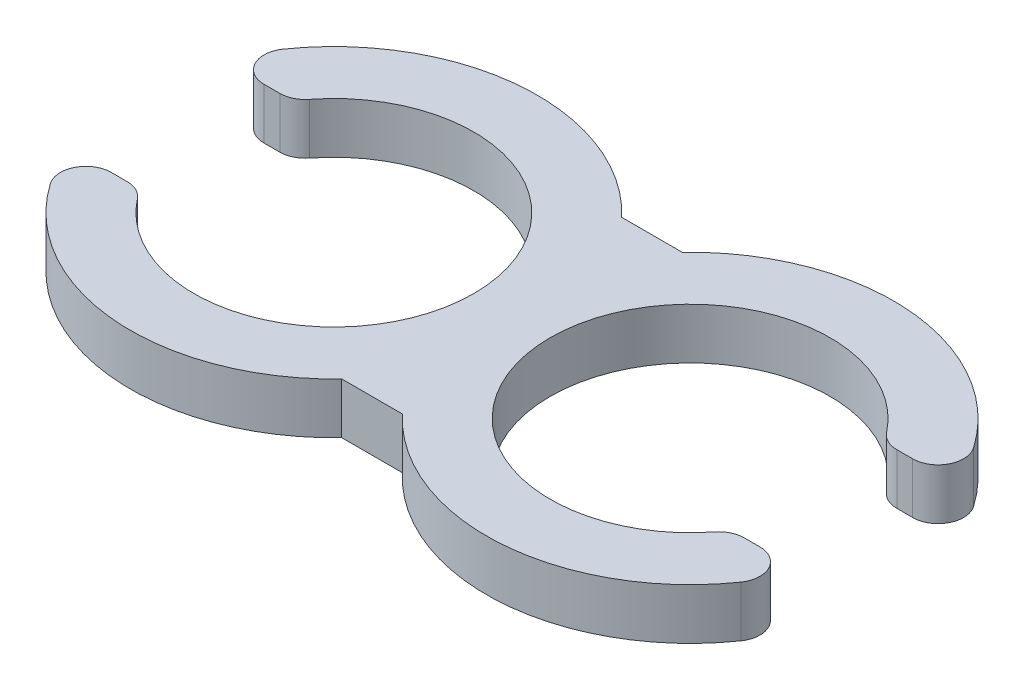
ISO-10303-21;
HEADER;
FILE_DESCRIPTION(('STEP AP214'),'2;1');
FILE_NAME('part.step','',(''),(''),'','','');
FILE_SCHEMA(('AUTOMOTIVE_DESIGN { 1 0 10303 214 1 1 1 1 }'));
ENDSEC;
DATA;
#1=APPLICATION_CONTEXT('core data for automotive mechanical design processes');
#2=APPLICATION_PROTOCOL_DEFINITION('international standard','automotive_design',2000,#1);
#3=PRODUCT_CONTEXT('',#1,'mechanical');
#4=PRODUCT('Part','Part','',(#3));
#5=PRODUCT_RELATED_PRODUCT_CATEGORY('part','',(#4));
#6=PRODUCT_DEFINITION_FORMATION('','',#4);
#7=PRODUCT_DEFINITION_CONTEXT('part definition',#1,'design');
#8=PRODUCT_DEFINITION('design','',#6,#7);
#9=PRODUCT_DEFINITION_SHAPE('','',#8);
#10=(LENGTH_UNIT() NAMED_UNIT(*) SI_UNIT(.MILLI.,.METRE.));
#11=(NAMED_UNIT(*) PLANE_ANGLE_UNIT() SI_UNIT($,.RADIAN.));
#12=(NAMED_UNIT(*) SI_UNIT($,.STERADIAN.) SOLID_ANGLE_UNIT());
#13=UNCERTAINTY_MEASURE_WITH_UNIT(LENGTH_MEASURE(1.E-05),#10,'distance_accuracy_value','');
#14=(GEOMETRIC_REPRESENTATION_CONTEXT(3) GLOBAL_UNCERTAINTY_ASSIGNED_CONTEXT((#13)) GLOBAL_UNIT_ASSIGNED_CONTEXT((#10,
#11,#12)) REPRESENTATION_CONTEXT('',''));
#15=CARTESIAN_POINT('',(0.,0.,0.));
#16=DIRECTION('',(0.,0.,1.));
#17=DIRECTION('',(1.,0.,0.));
#18=AXIS2_PLACEMENT_3D('',#15,#16,#17);
#19=CARTESIAN_POINT('',(0.,2.,3.));
#20=DIRECTION('',(0.,0.,1.));
#21=DIRECTION('',(1.,0.,0.));
#22=AXIS2_PLACEMENT_3D('',#19,#20,#21);
#23=PLANE('',#22);
#24=DIRECTION('',(-1.,0.,0.));
#25=VECTOR('',#24,1.);
#26=CARTESIAN_POINT('',(0.,2.,3.));
#27=LINE('',#26,#25);
#28=CARTESIAN_POINT('',(-12.1234753829798,2.,3.));
#29=VERTEX_POINT('',#28);
#30=CARTESIAN_POINT('',(-12.744562646538,2.,3.));
#31=VERTEX_POINT('',#30);
#32=EDGE_CURVE('E189',#29,#31,#27,.T.);
#33=ORIENTED_EDGE('',*,*,#32,.F.);
#34=DIRECTION('',(0.,1.,0.));
#35=VECTOR('',#34,1.);
#36=CARTESIAN_POINT('',(-12.1234753829798,0.,3.));
#37=LINE('',#36,#35);
#38=CARTESIAN_POINT('',(-12.1234753829798,0.,3.));
#39=VERTEX_POINT('',#38);
#40=EDGE_CURVE('E325',#29,#39,#37,.F.);
#41=ORIENTED_EDGE('',*,*,#40,.T.);
#42=DIRECTION('',(-1.,0.,0.));
#43=VECTOR('',#42,1.);
#44=CARTESIAN_POINT('',(0.,0.,3.));
#45=LINE('',#44,#43);
#46=CARTESIAN_POINT('',(-12.744562646538,0.,3.));
#47=VERTEX_POINT('',#46);
#48=EDGE_CURVE('E230',#39,#47,#45,.T.);
#49=ORIENTED_EDGE('',*,*,#48,.T.);
#50=DIRECTION('',(0.,-1.,0.));
#51=VECTOR('',#50,1.);
#52=CARTESIAN_POINT('',(-12.744562646538,2.,3.));
#53=LINE('',#52,#51);
#54=EDGE_CURVE('E293',#47,#31,#53,.F.);
#55=ORIENTED_EDGE('',*,*,#54,.T.);
#56=EDGE_LOOP('',(#33,#41,#49,#55));
#57=FACE_BOUND('',#56,.T.);
#58=ADVANCED_FACE('F41',(#57),#23,.F.);
#59=CARTESIAN_POINT('',(-7.,2.,0.));
#60=DIRECTION('',(0.,-1.,0.));
#61=DIRECTION('',(0.,0.,-1.));
#62=AXIS2_PLACEMENT_3D('',#59,#60,#61);
#63=CYLINDRICAL_SURFACE('',#62,8.);
#64=CARTESIAN_POINT('',(-7.,2.,0.));
#65=DIRECTION('',(0.,1.,0.));
#66=DIRECTION('',(0.,0.,1.));
#67=AXIS2_PLACEMENT_3D('',#64,#65,#66);
#68=CIRCLE('',#67,8.);
#69=CARTESIAN_POINT('',(-13.5652144531863,2.,4.57142857142857));
#70=VERTEX_POINT('',#69);
#71=CARTESIAN_POINT('',(-1.19052498068888,2.,5.5));
#72=VERTEX_POINT('',#71);
#73=EDGE_CURVE('E176',#70,#72,#68,.T.);
#74=ORIENTED_EDGE('',*,*,#73,.F.);
#75=DIRECTION('',(0.,-1.,0.));
#76=VECTOR('',#75,1.);
#77=CARTESIAN_POINT('',(-13.5652144531863,2.,4.57142857142857));
#78=LINE('',#77,#76);
#79=CARTESIAN_POINT('',(-13.5652144531863,0.,4.57142857142857));
#80=VERTEX_POINT('',#79);
#81=EDGE_CURVE('E291',#70,#80,#78,.T.);
#82=ORIENTED_EDGE('',*,*,#81,.T.);
#83=CARTESIAN_POINT('',(-7.,0.,0.));
#84=DIRECTION('',(0.,1.,0.));
#85=DIRECTION('',(0.,0.,1.));
#86=AXIS2_PLACEMENT_3D('',#83,#84,#85);
#87=CIRCLE('',#86,8.);
#88=CARTESIAN_POINT('',(-1.19052498068888,0.,5.5));
#89=VERTEX_POINT('',#88);
#90=EDGE_CURVE('E195',#80,#89,#87,.T.);
#91=ORIENTED_EDGE('',*,*,#90,.T.);
#92=DIRECTION('',(0.,-1.,0.));
#93=VECTOR('',#92,1.);
#94=CARTESIAN_POINT('',(-1.19052498068888,2.,5.5));
#95=LINE('',#94,#93);
#96=EDGE_CURVE('E192',#72,#89,#95,.T.);
#97=ORIENTED_EDGE('',*,*,#96,.F.);
#98=EDGE_LOOP('',(#74,#82,#91,#97));
#99=FACE_BOUND('',#98,.T.);
#100=ADVANCED_FACE('F193',(#99),#63,.T.);
#101=CARTESIAN_POINT('',(0.,2.,5.5));
#102=DIRECTION('',(0.,0.,-1.));
#103=DIRECTION('',(-1.,0.,0.));
#104=AXIS2_PLACEMENT_3D('',#101,#102,#103);
#105=PLANE('',#104);
#106=DIRECTION('',(1.,0.,0.));
#107=VECTOR('',#106,1.);
#108=CARTESIAN_POINT('',(0.,0.,5.5));
#109=LINE('',#108,#107);
#110=CARTESIAN_POINT('',(1.19052498068887,0.,5.5));
#111=VERTEX_POINT('',#110);
#112=EDGE_CURVE('E233',#89,#111,#109,.T.);
#113=ORIENTED_EDGE('',*,*,#112,.T.);
#114=DIRECTION('',(0.,-1.,0.));
#115=VECTOR('',#114,1.);
#116=CARTESIAN_POINT('',(1.19052498068887,2.,5.5));
#117=LINE('',#116,#115);
#118=CARTESIAN_POINT('',(1.19052498068887,2.,5.5));
#119=VERTEX_POINT('',#118);
#120=EDGE_CURVE('E199',#119,#111,#117,.T.);
#121=ORIENTED_EDGE('',*,*,#120,.F.);
#122=DIRECTION('',(1.,0.,0.));
#123=VECTOR('',#122,1.);
#124=CARTESIAN_POINT('',(0.,2.,5.5));
#125=LINE('',#124,#123);
#126=EDGE_CURVE('E182',#72,#119,#125,.T.);
#127=ORIENTED_EDGE('',*,*,#126,.F.);
#128=ORIENTED_EDGE('',*,*,#96,.T.);
#129=EDGE_LOOP('',(#113,#121,#127,#128));
#130=FACE_BOUND('',#129,.T.);
#131=ADVANCED_FACE('F201',(#130),#105,.F.);
#132=CARTESIAN_POINT('',(7.,2.,0.));
#133=DIRECTION('',(0.,-1.,0.));
#134=DIRECTION('',(0.,0.,-1.));
#135=AXIS2_PLACEMENT_3D('',#132,#133,#134);
#136=CYLINDRICAL_SURFACE('',#135,8.);
#137=CARTESIAN_POINT('',(7.,0.,0.));
#138=DIRECTION('',(0.,1.,0.));
#139=DIRECTION('',(0.,0.,1.));
#140=AXIS2_PLACEMENT_3D('',#137,#138,#139);
#141=CIRCLE('',#140,8.);
#142=CARTESIAN_POINT('',(13.5652144531863,0.,4.57142857142857));
#143=VERTEX_POINT('',#142);
#144=EDGE_CURVE('E235',#111,#143,#141,.T.);
#145=ORIENTED_EDGE('',*,*,#144,.T.);
#146=DIRECTION('',(0.,-1.,0.));
#147=VECTOR('',#146,1.);
#148=CARTESIAN_POINT('',(13.5652144531863,2.,4.57142857142857));
#149=LINE('',#148,#147);
#150=CARTESIAN_POINT('',(13.5652144531863,2.,4.57142857142857));
#151=VERTEX_POINT('',#150);
#152=EDGE_CURVE('E289',#143,#151,#149,.F.);
#153=ORIENTED_EDGE('',*,*,#152,.T.);
#154=CARTESIAN_POINT('',(7.,2.,0.));
#155=DIRECTION('',(0.,1.,0.));
#156=DIRECTION('',(0.,0.,1.));
#157=AXIS2_PLACEMENT_3D('',#154,#155,#156);
#158=CIRCLE('',#157,8.);
#159=EDGE_CURVE('E204',#119,#151,#158,.T.);
#160=ORIENTED_EDGE('',*,*,#159,.F.);
#161=ORIENTED_EDGE('',*,*,#120,.T.);
#162=EDGE_LOOP('',(#145,#153,#160,#161));
#163=FACE_BOUND('',#162,.T.);
#164=ADVANCED_FACE('F422',(#163),#136,.T.);
#165=CARTESIAN_POINT('',(0.,2.,3.));
#166=DIRECTION('',(0.,0.,1.));
#167=DIRECTION('',(1.,0.,0.));
#168=AXIS2_PLACEMENT_3D('',#165,#166,#167);
#169=PLANE('',#168);
#170=DIRECTION('',(-1.,0.,0.));
#171=VECTOR('',#170,1.);
#172=CARTESIAN_POINT('',(0.,0.,3.));
#173=LINE('',#172,#171);
#174=CARTESIAN_POINT('',(12.744562646538,0.,3.));
#175=VERTEX_POINT('',#174);
#176=CARTESIAN_POINT('',(12.1234753829798,0.,3.));
#177=VERTEX_POINT('',#176);
#178=EDGE_CURVE('E238',#175,#177,#173,.T.);
#179=ORIENTED_EDGE('',*,*,#178,.T.);
#180=DIRECTION('',(0.,1.,0.));
#181=VECTOR('',#180,1.);
#182=CARTESIAN_POINT('',(12.1234753829798,2.,3.));
#183=LINE('',#182,#181);
#184=CARTESIAN_POINT('',(12.1234753829798,2.,3.));
#185=VERTEX_POINT('',#184);
#186=EDGE_CURVE('E314',#177,#185,#183,.T.);
#187=ORIENTED_EDGE('',*,*,#186,.T.);
#188=DIRECTION('',(-1.,0.,0.));
#189=VECTOR('',#188,1.);
#190=CARTESIAN_POINT('',(0.,2.,3.));
#191=LINE('',#190,#189);
#192=CARTESIAN_POINT('',(12.744562646538,2.,3.));
#193=VERTEX_POINT('',#192);
#194=EDGE_CURVE('E206',#193,#185,#191,.T.);
#195=ORIENTED_EDGE('',*,*,#194,.F.);
#196=DIRECTION('',(0.,-1.,0.));
#197=VECTOR('',#196,1.);
#198=CARTESIAN_POINT('',(12.744562646538,2.,3.));
#199=LINE('',#198,#197);
#200=EDGE_CURVE('E286',#193,#175,#199,.T.);
#201=ORIENTED_EDGE('',*,*,#200,.T.);
#202=EDGE_LOOP('',(#179,#187,#195,#201));
#203=FACE_BOUND('',#202,.T.);
#204=ADVANCED_FACE('F418',(#203),#169,.F.);
#205=CARTESIAN_POINT('',(7.,2.,0.));
#206=DIRECTION('',(0.,-1.,0.));
#207=DIRECTION('',(0.,0.,-1.));
#208=AXIS2_PLACEMENT_3D('',#205,#206,#207);
#209=CYLINDRICAL_SURFACE('',#208,5.5);
#210=CARTESIAN_POINT('',(7.,2.,0.));
#211=DIRECTION('',(0.,1.,0.));
#212=DIRECTION('',(0.,0.,1.));
#213=AXIS2_PLACEMENT_3D('',#210,#211,#212);
#214=CIRCLE('',#213,5.5);
#215=CARTESIAN_POINT('',(11.3352484009829,2.,-3.38461538461539));
#216=VERTEX_POINT('',#215);
#217=CARTESIAN_POINT('',(11.3352484009829,2.,3.38461538461538));
#218=VERTEX_POINT('',#217);
#219=EDGE_CURVE('E211',#216,#218,#214,.T.);
#220=ORIENTED_EDGE('',*,*,#219,.T.);
#221=DIRECTION('',(0.,-1.,0.));
#222=VECTOR('',#221,1.);
#223=CARTESIAN_POINT('',(11.3352484009829,2.,3.38461538461538));
#224=LINE('',#223,#222);
#225=CARTESIAN_POINT('',(11.3352484009829,0.,3.38461538461538));
#226=VERTEX_POINT('',#225);
#227=EDGE_CURVE('E303',#218,#226,#224,.T.);
#228=ORIENTED_EDGE('',*,*,#227,.T.);
#229=CARTESIAN_POINT('',(7.,0.,0.));
#230=DIRECTION('',(0.,1.,0.));
#231=DIRECTION('',(0.,0.,1.));
#232=AXIS2_PLACEMENT_3D('',#229,#230,#231);
#233=CIRCLE('',#232,5.5);
#234=CARTESIAN_POINT('',(11.3352484009829,0.,-3.38461538461539));
#235=VERTEX_POINT('',#234);
#236=EDGE_CURVE('E241',#235,#226,#233,.T.);
#237=ORIENTED_EDGE('',*,*,#236,.F.);
#238=DIRECTION('',(0.,-1.,0.));
#239=VECTOR('',#238,1.);
#240=CARTESIAN_POINT('',(11.3352484009829,2.,-3.38461538461539));
#241=LINE('',#240,#239);
#242=EDGE_CURVE('E301',#235,#216,#241,.F.);
#243=ORIENTED_EDGE('',*,*,#242,.T.);
#244=EDGE_LOOP('',(#220,#228,#237,#243));
#245=FACE_BOUND('',#244,.T.);
#246=ADVANCED_FACE('F414',(#245),#209,.F.);
#247=CARTESIAN_POINT('',(0.,2.,-3.00000000000001));
#248=DIRECTION('',(0.,0.,1.));
#249=DIRECTION('',(1.,0.,0.));
#250=AXIS2_PLACEMENT_3D('',#247,#248,#249);
#251=PLANE('',#250);
#252=DIRECTION('',(-1.,0.,0.));
#253=VECTOR('',#252,1.);
#254=CARTESIAN_POINT('',(0.,2.,-3.00000000000001));
#255=LINE('',#254,#253);
#256=CARTESIAN_POINT('',(12.744562646538,2.,-3.00000000000001));
#257=VERTEX_POINT('',#256);
#258=CARTESIAN_POINT('',(12.1234753829798,2.,-3.00000000000001));
#259=VERTEX_POINT('',#258);
#260=EDGE_CURVE('E214',#257,#259,#255,.T.);
#261=ORIENTED_EDGE('',*,*,#260,.T.);
#262=DIRECTION('',(0.,-1.,0.));
#263=VECTOR('',#262,1.);
#264=CARTESIAN_POINT('',(12.1234753829798,2.,-3.00000000000001));
#265=LINE('',#264,#263);
#266=CARTESIAN_POINT('',(12.1234753829798,0.,-3.00000000000001));
#267=VERTEX_POINT('',#266);
#268=EDGE_CURVE('E322',#259,#267,#265,.T.);
#269=ORIENTED_EDGE('',*,*,#268,.T.);
#270=DIRECTION('',(-1.,0.,0.));
#271=VECTOR('',#270,1.);
#272=CARTESIAN_POINT('',(0.,0.,-3.00000000000001));
#273=LINE('',#272,#271);
#274=CARTESIAN_POINT('',(12.744562646538,0.,-3.00000000000001));
#275=VERTEX_POINT('',#274);
#276=EDGE_CURVE('E244',#275,#267,#273,.T.);
#277=ORIENTED_EDGE('',*,*,#276,.F.);
#278=DIRECTION('',(0.,1.,0.));
#279=VECTOR('',#278,1.);
#280=CARTESIAN_POINT('',(12.744562646538,2.,-3.00000000000001));
#281=LINE('',#280,#279);
#282=EDGE_CURVE('E276',#275,#257,#281,.T.);
#283=ORIENTED_EDGE('',*,*,#282,.T.);
#284=EDGE_LOOP('',(#261,#269,#277,#283));
#285=FACE_BOUND('',#284,.T.);
#286=ADVANCED_FACE('F411',(#285),#251,.T.);
#287=CARTESIAN_POINT('',(7.,2.,0.));
#288=DIRECTION('',(0.,-1.,0.));
#289=DIRECTION('',(0.,0.,-1.));
#290=AXIS2_PLACEMENT_3D('',#287,#288,#289);
#291=CYLINDRICAL_SURFACE('',#290,8.);
#292=CARTESIAN_POINT('',(7.,2.,0.));
#293=DIRECTION('',(0.,1.,0.));
#294=DIRECTION('',(0.,0.,1.));
#295=AXIS2_PLACEMENT_3D('',#292,#293,#294);
#296=CIRCLE('',#295,8.);
#297=CARTESIAN_POINT('',(13.5652144531863,2.,-4.57142857142858));
#298=VERTEX_POINT('',#297);
#299=CARTESIAN_POINT('',(1.19052498068887,2.,-5.5));
#300=VERTEX_POINT('',#299);
#301=EDGE_CURVE('E217',#298,#300,#296,.T.);
#302=ORIENTED_EDGE('',*,*,#301,.F.);
#303=DIRECTION('',(0.,-1.,0.));
#304=VECTOR('',#303,1.);
#305=CARTESIAN_POINT('',(13.5652144531863,2.,-4.57142857142858));
#306=LINE('',#305,#304);
#307=CARTESIAN_POINT('',(13.5652144531863,0.,-4.57142857142858));
#308=VERTEX_POINT('',#307);
#309=EDGE_CURVE('E198',#298,#308,#306,.T.);
#310=ORIENTED_EDGE('',*,*,#309,.T.);
#311=CARTESIAN_POINT('',(7.,0.,0.));
#312=DIRECTION('',(0.,1.,0.));
#313=DIRECTION('',(0.,0.,1.));
#314=AXIS2_PLACEMENT_3D('',#311,#312,#313);
#315=CIRCLE('',#314,8.);
#316=CARTESIAN_POINT('',(1.19052498068887,0.,-5.5));
#317=VERTEX_POINT('',#316);
#318=EDGE_CURVE('E247',#308,#317,#315,.T.);
#319=ORIENTED_EDGE('',*,*,#318,.T.);
#320=DIRECTION('',(0.,-1.,0.));
#321=VECTOR('',#320,1.);
#322=CARTESIAN_POINT('',(1.19052498068887,2.,-5.5));
#323=LINE('',#322,#321);
#324=EDGE_CURVE('E261',#300,#317,#323,.T.);
#325=ORIENTED_EDGE('',*,*,#324,.F.);
#326=EDGE_LOOP('',(#302,#310,#319,#325));
#327=FACE_BOUND('',#326,.T.);
#328=ADVANCED_FACE('F381',(#327),#291,.T.);
#329=CARTESIAN_POINT('',(0.,2.,-5.5));
#330=DIRECTION('',(0.,0.,-1.));
#331=DIRECTION('',(-1.,0.,0.));
#332=AXIS2_PLACEMENT_3D('',#329,#330,#331);
#333=PLANE('',#332);
#334=DIRECTION('',(1.,0.,0.));
#335=VECTOR('',#334,1.);
#336=CARTESIAN_POINT('',(0.,0.,-5.5));
#337=LINE('',#336,#335);
#338=CARTESIAN_POINT('',(-1.19052498068888,0.,-5.5));
#339=VERTEX_POINT('',#338);
#340=EDGE_CURVE('E249',#339,#317,#337,.T.);
#341=ORIENTED_EDGE('',*,*,#340,.F.);
#342=DIRECTION('',(0.,-1.,0.));
#343=VECTOR('',#342,1.);
#344=CARTESIAN_POINT('',(-1.19052498068888,2.,-5.5));
#345=LINE('',#344,#343);
#346=CARTESIAN_POINT('',(-1.19052498068888,2.,-5.5));
#347=VERTEX_POINT('',#346);
#348=EDGE_CURVE('E229',#347,#339,#345,.T.);
#349=ORIENTED_EDGE('',*,*,#348,.F.);
#350=DIRECTION('',(1.,0.,0.));
#351=VECTOR('',#350,1.);
#352=CARTESIAN_POINT('',(0.,2.,-5.5));
#353=LINE('',#352,#351);
#354=EDGE_CURVE('E219',#347,#300,#353,.T.);
#355=ORIENTED_EDGE('',*,*,#354,.T.);
#356=ORIENTED_EDGE('',*,*,#324,.T.);
#357=EDGE_LOOP('',(#341,#349,#355,#356));
#358=FACE_BOUND('',#357,.T.);
#359=ADVANCED_FACE('F385',(#358),#333,.T.);
#360=CARTESIAN_POINT('',(-7.,2.,0.));
#361=DIRECTION('',(0.,-1.,0.));
#362=DIRECTION('',(0.,0.,-1.));
#363=AXIS2_PLACEMENT_3D('',#360,#361,#362);
#364=CYLINDRICAL_SURFACE('',#363,8.);
#365=CARTESIAN_POINT('',(-7.,0.,0.));
#366=DIRECTION('',(0.,1.,0.));
#367=DIRECTION('',(0.,0.,1.));
#368=AXIS2_PLACEMENT_3D('',#365,#366,#367);
#369=CIRCLE('',#368,8.);
#370=CARTESIAN_POINT('',(-13.5652144531863,0.,-4.57142857142857));
#371=VERTEX_POINT('',#370);
#372=EDGE_CURVE('E252',#339,#371,#369,.T.);
#373=ORIENTED_EDGE('',*,*,#372,.T.);
#374=DIRECTION('',(0.,-1.,0.));
#375=VECTOR('',#374,1.);
#376=CARTESIAN_POINT('',(-13.5652144531863,2.,-4.57142857142857));
#377=LINE('',#376,#375);
#378=CARTESIAN_POINT('',(-13.5652144531863,2.,-4.57142857142857));
#379=VERTEX_POINT('',#378);
#380=EDGE_CURVE('E299',#371,#379,#377,.F.);
#381=ORIENTED_EDGE('',*,*,#380,.T.);
#382=CARTESIAN_POINT('',(-7.,2.,0.));
#383=DIRECTION('',(0.,1.,0.));
#384=DIRECTION('',(0.,0.,1.));
#385=AXIS2_PLACEMENT_3D('',#382,#383,#384);
#386=CIRCLE('',#385,8.);
#387=EDGE_CURVE('E222',#347,#379,#386,.T.);
#388=ORIENTED_EDGE('',*,*,#387,.F.);
#389=ORIENTED_EDGE('',*,*,#348,.T.);
#390=EDGE_LOOP('',(#373,#381,#388,#389));
#391=FACE_BOUND('',#390,.T.);
#392=ADVANCED_FACE('F398',(#391),#364,.T.);
#393=CARTESIAN_POINT('',(0.,2.,-3.00000000000001));
#394=DIRECTION('',(0.,0.,1.));
#395=DIRECTION('',(1.,0.,0.));
#396=AXIS2_PLACEMENT_3D('',#393,#394,#395);
#397=PLANE('',#396);
#398=DIRECTION('',(-1.,0.,0.));
#399=VECTOR('',#398,1.);
#400=CARTESIAN_POINT('',(0.,0.,-3.00000000000001));
#401=LINE('',#400,#399);
#402=CARTESIAN_POINT('',(-12.1234753829798,0.,-3.));
#403=VERTEX_POINT('',#402);
#404=CARTESIAN_POINT('',(-12.744562646538,0.,-3.));
#405=VERTEX_POINT('',#404);
#406=EDGE_CURVE('E255',#403,#405,#401,.T.);
#407=ORIENTED_EDGE('',*,*,#406,.F.);
#408=DIRECTION('',(0.,-1.,0.));
#409=VECTOR('',#408,1.);
#410=CARTESIAN_POINT('',(-12.1234753829798,2.,-3.));
#411=LINE('',#410,#409);
#412=CARTESIAN_POINT('',(-12.1234753829798,2.,-3.));
#413=VERTEX_POINT('',#412);
#414=EDGE_CURVE('E11',#403,#413,#411,.F.);
#415=ORIENTED_EDGE('',*,*,#414,.T.);
#416=DIRECTION('',(-1.,0.,0.));
#417=VECTOR('',#416,1.);
#418=CARTESIAN_POINT('',(0.,2.,-3.00000000000001));
#419=LINE('',#418,#417);
#420=CARTESIAN_POINT('',(-12.744562646538,2.,-3.));
#421=VERTEX_POINT('',#420);
#422=EDGE_CURVE('E225',#413,#421,#419,.T.);
#423=ORIENTED_EDGE('',*,*,#422,.T.);
#424=DIRECTION('',(0.,1.,0.));
#425=VECTOR('',#424,1.);
#426=CARTESIAN_POINT('',(-12.744562646538,0.,-3.));
#427=LINE('',#426,#425);
#428=EDGE_CURVE('E296',#421,#405,#427,.F.);
#429=ORIENTED_EDGE('',*,*,#428,.T.);
#430=EDGE_LOOP('',(#407,#415,#423,#429));
#431=FACE_BOUND('',#430,.T.);
#432=ADVANCED_FACE('F394',(#431),#397,.T.);
#433=CARTESIAN_POINT('',(-7.,2.,0.));
#434=DIRECTION('',(0.,-1.,0.));
#435=DIRECTION('',(0.,0.,-1.));
#436=AXIS2_PLACEMENT_3D('',#433,#434,#435);
#437=CYLINDRICAL_SURFACE('',#436,5.5);
#438=CARTESIAN_POINT('',(-7.,0.,0.));
#439=DIRECTION('',(0.,1.,0.));
#440=DIRECTION('',(0.,0.,1.));
#441=AXIS2_PLACEMENT_3D('',#438,#439,#440);
#442=CIRCLE('',#441,5.5);
#443=CARTESIAN_POINT('',(-11.3352484009829,0.,3.38461538461538));
#444=VERTEX_POINT('',#443);
#445=CARTESIAN_POINT('',(-11.3352484009829,0.,-3.38461538461539));
#446=VERTEX_POINT('',#445);
#447=EDGE_CURVE('E257',#444,#446,#442,.T.);
#448=ORIENTED_EDGE('',*,*,#447,.F.);
#449=DIRECTION('',(0.,-1.,0.));
#450=VECTOR('',#449,1.);
#451=CARTESIAN_POINT('',(-11.3352484009829,2.,3.38461538461538));
#452=LINE('',#451,#450);
#453=CARTESIAN_POINT('',(-11.3352484009829,2.,3.38461538461538));
#454=VERTEX_POINT('',#453);
#455=EDGE_CURVE('E49',#444,#454,#452,.F.);
#456=ORIENTED_EDGE('',*,*,#455,.T.);
#457=CARTESIAN_POINT('',(-7.,2.,0.));
#458=DIRECTION('',(0.,1.,0.));
#459=DIRECTION('',(0.,0.,1.));
#460=AXIS2_PLACEMENT_3D('',#457,#458,#459);
#461=CIRCLE('',#460,5.5);
#462=CARTESIAN_POINT('',(-11.3352484009829,2.,-3.38461538461539));
#463=VERTEX_POINT('',#462);
#464=EDGE_CURVE('E227',#454,#463,#461,.T.);
#465=ORIENTED_EDGE('',*,*,#464,.T.);
#466=DIRECTION('',(0.,-1.,0.));
#467=VECTOR('',#466,1.);
#468=CARTESIAN_POINT('',(-11.3352484009829,2.,-3.38461538461539));
#469=LINE('',#468,#467);
#470=EDGE_CURVE('E328',#463,#446,#469,.T.);
#471=ORIENTED_EDGE('',*,*,#470,.T.);
#472=EDGE_LOOP('',(#448,#456,#465,#471));
#473=FACE_BOUND('',#472,.T.);
#474=ADVANCED_FACE('F333',(#473),#437,.F.);
#475=CARTESIAN_POINT('',(0.,2.,0.));
#476=DIRECTION('',(0.,1.,0.));
#477=DIRECTION('',(0.,0.,1.));
#478=AXIS2_PLACEMENT_3D('',#475,#476,#477);
#479=PLANE('',#478);
#480=ORIENTED_EDGE('',*,*,#194,.T.);
#481=CARTESIAN_POINT('',(12.1234753829798,2.,3.99999999999999));
#482=DIRECTION('',(0.,1.,0.));
#483=DIRECTION('',(0.,0.,1.));
#484=AXIS2_PLACEMENT_3D('',#481,#482,#483);
#485=CIRCLE('',#484,1.);
#486=EDGE_CURVE('E320',#185,#218,#485,.T.);
#487=ORIENTED_EDGE('',*,*,#486,.T.);
#488=ORIENTED_EDGE('',*,*,#219,.F.);
#489=CARTESIAN_POINT('',(12.1234753829798,2.,-4.00000000000001));
#490=DIRECTION('',(0.,1.,0.));
#491=DIRECTION('',(0.,0.,1.));
#492=AXIS2_PLACEMENT_3D('',#489,#490,#491);
#493=CIRCLE('',#492,1.);
#494=EDGE_CURVE('E318',#216,#259,#493,.T.);
#495=ORIENTED_EDGE('',*,*,#494,.T.);
#496=ORIENTED_EDGE('',*,*,#260,.F.);
#497=CARTESIAN_POINT('',(12.744562646538,2.,-4.00000000000001));
#498=DIRECTION('',(0.,1.,0.));
#499=DIRECTION('',(0.,0.,1.));
#500=AXIS2_PLACEMENT_3D('',#497,#498,#499);
#501=CIRCLE('',#500,1.);
#502=EDGE_CURVE('E284',#257,#298,#501,.T.);
#503=ORIENTED_EDGE('',*,*,#502,.T.);
#504=ORIENTED_EDGE('',*,*,#301,.T.);
#505=ORIENTED_EDGE('',*,*,#354,.F.);
#506=ORIENTED_EDGE('',*,*,#387,.T.);
#507=CARTESIAN_POINT('',(-12.744562646538,2.,-4.));
#508=DIRECTION('',(0.,1.,0.));
#509=DIRECTION('',(0.,0.,1.));
#510=AXIS2_PLACEMENT_3D('',#507,#508,#509);
#511=CIRCLE('',#510,1.);
#512=EDGE_CURVE('E278',#379,#421,#511,.T.);
#513=ORIENTED_EDGE('',*,*,#512,.T.);
#514=ORIENTED_EDGE('',*,*,#422,.F.);
#515=CARTESIAN_POINT('',(-12.1234753829798,2.,-4.));
#516=DIRECTION('',(0.,1.,0.));
#517=DIRECTION('',(0.,0.,1.));
#518=AXIS2_PLACEMENT_3D('',#515,#516,#517);
#519=CIRCLE('',#518,1.);
#520=EDGE_CURVE('E62',#413,#463,#519,.T.);
#521=ORIENTED_EDGE('',*,*,#520,.T.);
#522=ORIENTED_EDGE('',*,*,#464,.F.);
#523=CARTESIAN_POINT('',(-12.1234753829798,2.,4.));
#524=DIRECTION('',(0.,1.,0.));
#525=DIRECTION('',(0.,0.,1.));
#526=AXIS2_PLACEMENT_3D('',#523,#524,#525);
#527=CIRCLE('',#526,1.);
#528=EDGE_CURVE('E56',#454,#29,#527,.T.);
#529=ORIENTED_EDGE('',*,*,#528,.T.);
#530=ORIENTED_EDGE('',*,*,#32,.T.);
#531=CARTESIAN_POINT('',(-12.744562646538,2.,4.));
#532=DIRECTION('',(0.,1.,0.));
#533=DIRECTION('',(0.,0.,1.));
#534=AXIS2_PLACEMENT_3D('',#531,#532,#533);
#535=CIRCLE('',#534,1.);
#536=EDGE_CURVE('E185',#31,#70,#535,.T.);
#537=ORIENTED_EDGE('',*,*,#536,.T.);
#538=ORIENTED_EDGE('',*,*,#73,.T.);
#539=ORIENTED_EDGE('',*,*,#126,.T.);
#540=ORIENTED_EDGE('',*,*,#159,.T.);
#541=CARTESIAN_POINT('',(12.744562646538,2.,3.99999999999999));
#542=DIRECTION('',(0.,1.,0.));
#543=DIRECTION('',(0.,0.,1.));
#544=AXIS2_PLACEMENT_3D('',#541,#542,#543);
#545=CIRCLE('',#544,1.);
#546=EDGE_CURVE('E282',#151,#193,#545,.T.);
#547=ORIENTED_EDGE('',*,*,#546,.T.);
#548=EDGE_LOOP('',(#480,#487,#488,#495,#496,#503,#504,#505,#506,#513,#514,#521,#522,#529,#530,
#537,#538,#539,#540,#547));
#549=FACE_BOUND('',#548,.T.);
#550=ADVANCED_FACE('F179',(#549),#479,.T.);
#551=CARTESIAN_POINT('',(0.,0.,0.));
#552=DIRECTION('',(0.,1.,0.));
#553=DIRECTION('',(0.,0.,1.));
#554=AXIS2_PLACEMENT_3D('',#551,#552,#553);
#555=PLANE('',#554);
#556=ORIENTED_EDGE('',*,*,#236,.T.);
#557=CARTESIAN_POINT('',(12.1234753829798,0.,3.99999999999999));
#558=DIRECTION('',(0.,1.,0.));
#559=DIRECTION('',(0.,0.,1.));
#560=AXIS2_PLACEMENT_3D('',#557,#558,#559);
#561=CIRCLE('',#560,1.);
#562=EDGE_CURVE('E312',#226,#177,#561,.F.);
#563=ORIENTED_EDGE('',*,*,#562,.T.);
#564=ORIENTED_EDGE('',*,*,#178,.F.);
#565=CARTESIAN_POINT('',(12.744562646538,0.,3.99999999999999));
#566=DIRECTION('',(0.,1.,0.));
#567=DIRECTION('',(0.,0.,1.));
#568=AXIS2_PLACEMENT_3D('',#565,#566,#567);
#569=CIRCLE('',#568,1.);
#570=EDGE_CURVE('E272',#175,#143,#569,.F.);
#571=ORIENTED_EDGE('',*,*,#570,.T.);
#572=ORIENTED_EDGE('',*,*,#144,.F.);
#573=ORIENTED_EDGE('',*,*,#112,.F.);
#574=ORIENTED_EDGE('',*,*,#90,.F.);
#575=CARTESIAN_POINT('',(-12.744562646538,0.,4.));
#576=DIRECTION('',(0.,1.,0.));
#577=DIRECTION('',(0.,0.,1.));
#578=AXIS2_PLACEMENT_3D('',#575,#576,#577);
#579=CIRCLE('',#578,1.);
#580=EDGE_CURVE('E269',#80,#47,#579,.F.);
#581=ORIENTED_EDGE('',*,*,#580,.T.);
#582=ORIENTED_EDGE('',*,*,#48,.F.);
#583=CARTESIAN_POINT('',(-12.1234753829798,0.,4.));
#584=DIRECTION('',(0.,1.,0.));
#585=DIRECTION('',(0.,0.,1.));
#586=AXIS2_PLACEMENT_3D('',#583,#584,#585);
#587=CIRCLE('',#586,1.);
#588=EDGE_CURVE('E308',#39,#444,#587,.F.);
#589=ORIENTED_EDGE('',*,*,#588,.T.);
#590=ORIENTED_EDGE('',*,*,#447,.T.);
#591=CARTESIAN_POINT('',(-12.1234753829798,0.,-4.));
#592=DIRECTION('',(0.,1.,0.));
#593=DIRECTION('',(0.,0.,1.));
#594=AXIS2_PLACEMENT_3D('',#591,#592,#593);
#595=CIRCLE('',#594,1.);
#596=EDGE_CURVE('E306',#446,#403,#595,.F.);
#597=ORIENTED_EDGE('',*,*,#596,.T.);
#598=ORIENTED_EDGE('',*,*,#406,.T.);
#599=CARTESIAN_POINT('',(-12.744562646538,0.,-4.));
#600=DIRECTION('',(0.,1.,0.));
#601=DIRECTION('',(0.,0.,1.));
#602=AXIS2_PLACEMENT_3D('',#599,#600,#601);
#603=CIRCLE('',#602,1.);
#604=EDGE_CURVE('E267',#405,#371,#603,.F.);
#605=ORIENTED_EDGE('',*,*,#604,.T.);
#606=ORIENTED_EDGE('',*,*,#372,.F.);
#607=ORIENTED_EDGE('',*,*,#340,.T.);
#608=ORIENTED_EDGE('',*,*,#318,.F.);
#609=CARTESIAN_POINT('',(12.744562646538,0.,-4.00000000000001));
#610=DIRECTION('',(0.,1.,0.));
#611=DIRECTION('',(0.,0.,1.));
#612=AXIS2_PLACEMENT_3D('',#609,#610,#611);
#613=CIRCLE('',#612,1.);
#614=EDGE_CURVE('E274',#308,#275,#613,.F.);
#615=ORIENTED_EDGE('',*,*,#614,.T.);
#616=ORIENTED_EDGE('',*,*,#276,.T.);
#617=CARTESIAN_POINT('',(12.1234753829798,0.,-4.00000000000001));
#618=DIRECTION('',(0.,1.,0.));
#619=DIRECTION('',(0.,0.,1.));
#620=AXIS2_PLACEMENT_3D('',#617,#618,#619);
#621=CIRCLE('',#620,1.);
#622=EDGE_CURVE('E310',#267,#235,#621,.F.);
#623=ORIENTED_EDGE('',*,*,#622,.T.);
#624=EDGE_LOOP('',(#556,#563,#564,#571,#572,#573,#574,#581,#582,#589,#590,#597,#598,#605,#606,
#607,#608,#615,#616,#623));
#625=FACE_BOUND('',#624,.T.);
#626=ADVANCED_FACE('F341',(#625),#555,.F.);
#627=CARTESIAN_POINT('',(12.744562646538,2.,-4.00000000000001));
#628=DIRECTION('',(0.,-1.,0.));
#629=DIRECTION('',(0.,0.,-1.));
#630=AXIS2_PLACEMENT_3D('',#627,#628,#629);
#631=CYLINDRICAL_SURFACE('',#630,1.);
#632=ORIENTED_EDGE('',*,*,#502,.F.);
#633=ORIENTED_EDGE('',*,*,#282,.F.);
#634=ORIENTED_EDGE('',*,*,#614,.F.);
#635=ORIENTED_EDGE('',*,*,#309,.F.);
#636=EDGE_LOOP('',(#632,#633,#634,#635));
#637=FACE_BOUND('',#636,.T.);
#638=ADVANCED_FACE('F356',(#637),#631,.T.);
#639=CARTESIAN_POINT('',(12.744562646538,2.,3.99999999999999));
#640=DIRECTION('',(0.,-1.,0.));
#641=DIRECTION('',(0.,0.,-1.));
#642=AXIS2_PLACEMENT_3D('',#639,#640,#641);
#643=CYLINDRICAL_SURFACE('',#642,1.);
#644=ORIENTED_EDGE('',*,*,#546,.F.);
#645=ORIENTED_EDGE('',*,*,#152,.F.);
#646=ORIENTED_EDGE('',*,*,#570,.F.);
#647=ORIENTED_EDGE('',*,*,#200,.F.);
#648=EDGE_LOOP('',(#644,#645,#646,#647));
#649=FACE_BOUND('',#648,.T.);
#650=ADVANCED_FACE('F347',(#649),#643,.T.);
#651=CARTESIAN_POINT('',(-12.744562646538,2.,4.));
#652=DIRECTION('',(0.,-1.,0.));
#653=DIRECTION('',(0.,0.,-1.));
#654=AXIS2_PLACEMENT_3D('',#651,#652,#653);
#655=CYLINDRICAL_SURFACE('',#654,1.);
#656=ORIENTED_EDGE('',*,*,#536,.F.);
#657=ORIENTED_EDGE('',*,*,#54,.F.);
#658=ORIENTED_EDGE('',*,*,#580,.F.);
#659=ORIENTED_EDGE('',*,*,#81,.F.);
#660=EDGE_LOOP('',(#656,#657,#658,#659));
#661=FACE_BOUND('',#660,.T.);
#662=ADVANCED_FACE('F344',(#661),#655,.T.);
#663=CARTESIAN_POINT('',(-12.744562646538,2.,-4.));
#664=DIRECTION('',(0.,-1.,0.));
#665=DIRECTION('',(0.,0.,-1.));
#666=AXIS2_PLACEMENT_3D('',#663,#664,#665);
#667=CYLINDRICAL_SURFACE('',#666,1.);
#668=ORIENTED_EDGE('',*,*,#512,.F.);
#669=ORIENTED_EDGE('',*,*,#380,.F.);
#670=ORIENTED_EDGE('',*,*,#604,.F.);
#671=ORIENTED_EDGE('',*,*,#428,.F.);
#672=EDGE_LOOP('',(#668,#669,#670,#671));
#673=FACE_BOUND('',#672,.T.);
#674=ADVANCED_FACE('F346',(#673),#667,.T.);
#675=CARTESIAN_POINT('',(12.1234753829798,2.,3.99999999999999));
#676=DIRECTION('',(0.,-1.,0.));
#677=DIRECTION('',(0.,0.,-1.));
#678=AXIS2_PLACEMENT_3D('',#675,#676,#677);
#679=CYLINDRICAL_SURFACE('',#678,1.);
#680=ORIENTED_EDGE('',*,*,#486,.F.);
#681=ORIENTED_EDGE('',*,*,#186,.F.);
#682=ORIENTED_EDGE('',*,*,#562,.F.);
#683=ORIENTED_EDGE('',*,*,#227,.F.);
#684=EDGE_LOOP('',(#680,#681,#682,#683));
#685=FACE_BOUND('',#684,.T.);
#686=ADVANCED_FACE('F353',(#685),#679,.T.);
#687=CARTESIAN_POINT('',(12.1234753829798,2.,-4.00000000000001));
#688=DIRECTION('',(0.,-1.,0.));
#689=DIRECTION('',(0.,0.,-1.));
#690=AXIS2_PLACEMENT_3D('',#687,#688,#689);
#691=CYLINDRICAL_SURFACE('',#690,1.);
#692=ORIENTED_EDGE('',*,*,#494,.F.);
#693=ORIENTED_EDGE('',*,*,#242,.F.);
#694=ORIENTED_EDGE('',*,*,#622,.F.);
#695=ORIENTED_EDGE('',*,*,#268,.F.);
#696=EDGE_LOOP('',(#692,#693,#694,#695));
#697=FACE_BOUND('',#696,.T.);
#698=ADVANCED_FACE('F556',(#697),#691,.T.);
#699=CARTESIAN_POINT('',(-12.1234753829798,2.,4.));
#700=DIRECTION('',(0.,-1.,0.));
#701=DIRECTION('',(0.,0.,-1.));
#702=AXIS2_PLACEMENT_3D('',#699,#700,#701);
#703=CYLINDRICAL_SURFACE('',#702,1.);
#704=ORIENTED_EDGE('',*,*,#528,.F.);
#705=ORIENTED_EDGE('',*,*,#455,.F.);
#706=ORIENTED_EDGE('',*,*,#588,.F.);
#707=ORIENTED_EDGE('',*,*,#40,.F.);
#708=EDGE_LOOP('',(#704,#705,#706,#707));
#709=FACE_BOUND('',#708,.T.);
#710=ADVANCED_FACE('F337',(#709),#703,.T.);
#711=CARTESIAN_POINT('',(-12.1234753829798,2.,-4.));
#712=DIRECTION('',(0.,-1.,0.));
#713=DIRECTION('',(0.,0.,-1.));
#714=AXIS2_PLACEMENT_3D('',#711,#712,#713);
#715=CYLINDRICAL_SURFACE('',#714,1.);
#716=ORIENTED_EDGE('',*,*,#520,.F.);
#717=ORIENTED_EDGE('',*,*,#414,.F.);
#718=ORIENTED_EDGE('',*,*,#596,.F.);
#719=ORIENTED_EDGE('',*,*,#470,.F.);
#720=EDGE_LOOP('',(#716,#717,#718,#719));
#721=FACE_BOUND('',#720,.T.);
#722=ADVANCED_FACE('F43',(#721),#715,.T.);
#723=CLOSED_SHELL('',(#58,#100,#131,#164,#204,#246,#286,#328,#359,#392,#432,#474,#550,#626,#638,
#650,#662,#674,#686,#698,#710,#722));
#724=MANIFOLD_SOLID_BREP('B2',#723);
#725=ADVANCED_BREP_SHAPE_REPRESENTATION('',(#18,#724),#14);
#726=SHAPE_DEFINITION_REPRESENTATION(#9,#725);
ENDSEC;
END-ISO-10303-21;
